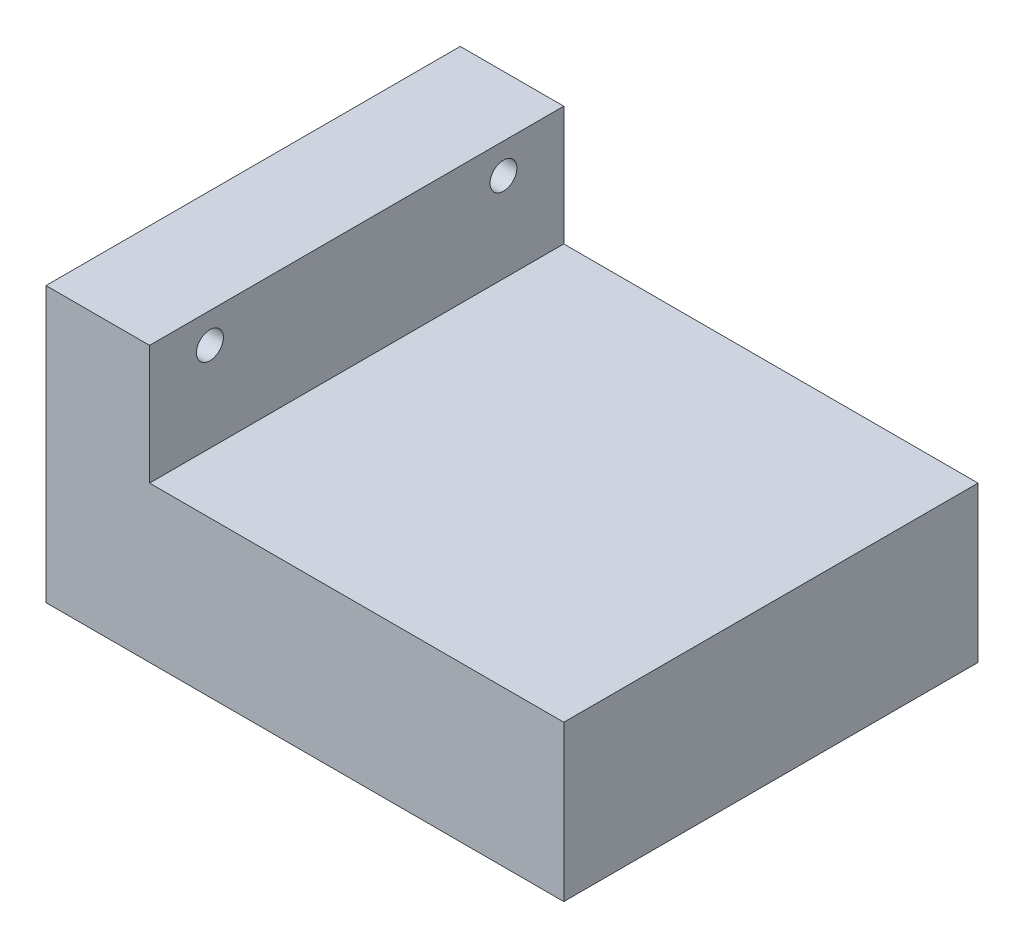
ISO-10303-21;
HEADER;
FILE_DESCRIPTION(('STEP AP214'),'2;1');
FILE_NAME('part.step','',(''),(''),'','','');
FILE_SCHEMA(('AUTOMOTIVE_DESIGN { 1 0 10303 214 1 1 1 1 }'));
ENDSEC;
DATA;
#1=APPLICATION_CONTEXT('core data for automotive mechanical design processes');
#2=APPLICATION_PROTOCOL_DEFINITION('international standard','automotive_design',2000,#1);
#3=PRODUCT_CONTEXT('',#1,'mechanical');
#4=PRODUCT('Part','Part','',(#3));
#5=PRODUCT_RELATED_PRODUCT_CATEGORY('part','',(#4));
#6=PRODUCT_DEFINITION_FORMATION('','',#4);
#7=PRODUCT_DEFINITION_CONTEXT('part definition',#1,'design');
#8=PRODUCT_DEFINITION('design','',#6,#7);
#9=PRODUCT_DEFINITION_SHAPE('','',#8);
#10=(LENGTH_UNIT() NAMED_UNIT(*) SI_UNIT(.MILLI.,.METRE.));
#11=(NAMED_UNIT(*) PLANE_ANGLE_UNIT() SI_UNIT($,.RADIAN.));
#12=(NAMED_UNIT(*) SI_UNIT($,.STERADIAN.) SOLID_ANGLE_UNIT());
#13=UNCERTAINTY_MEASURE_WITH_UNIT(LENGTH_MEASURE(1.E-05),#10,'distance_accuracy_value','');
#14=(GEOMETRIC_REPRESENTATION_CONTEXT(3) GLOBAL_UNCERTAINTY_ASSIGNED_CONTEXT((#13)) GLOBAL_UNIT_ASSIGNED_CONTEXT((#10,
#11,#12)) REPRESENTATION_CONTEXT('',''));
#15=CARTESIAN_POINT('',(0.,0.,0.));
#16=DIRECTION('',(0.,0.,1.));
#17=DIRECTION('',(1.,0.,0.));
#18=AXIS2_PLACEMENT_3D('',#15,#16,#17);
#19=CARTESIAN_POINT('',(31.75,19.05,0.));
#20=DIRECTION('',(1.,0.,0.));
#21=DIRECTION('',(0.,0.,-1.));
#22=AXIS2_PLACEMENT_3D('',#19,#20,#21);
#23=PLANE('',#22);
#24=DIRECTION('',(0.,0.,1.));
#25=VECTOR('',#24,1.);
#26=CARTESIAN_POINT('',(31.75,0.,0.));
#27=LINE('',#26,#25);
#28=CARTESIAN_POINT('',(31.75,0.,-25.4));
#29=VERTEX_POINT('',#28);
#30=CARTESIAN_POINT('',(31.75,0.,25.4));
#31=VERTEX_POINT('',#30);
#32=EDGE_CURVE('E83',#29,#31,#27,.T.);
#33=ORIENTED_EDGE('',*,*,#32,.F.);
#34=DIRECTION('',(0.,-1.,0.));
#35=VECTOR('',#34,1.);
#36=CARTESIAN_POINT('',(31.75,19.05,-25.4));
#37=LINE('',#36,#35);
#38=CARTESIAN_POINT('',(31.75,19.05,-25.4));
#39=VERTEX_POINT('',#38);
#40=EDGE_CURVE('E11',#39,#29,#37,.T.);
#41=ORIENTED_EDGE('',*,*,#40,.F.);
#42=DIRECTION('',(0.,0.,1.));
#43=VECTOR('',#42,1.);
#44=CARTESIAN_POINT('',(31.75,19.05,0.));
#45=LINE('',#44,#43);
#46=CARTESIAN_POINT('',(31.75,19.05,25.4));
#47=VERTEX_POINT('',#46);
#48=EDGE_CURVE('E81',#39,#47,#45,.T.);
#49=ORIENTED_EDGE('',*,*,#48,.T.);
#50=DIRECTION('',(0.,-1.,0.));
#51=VECTOR('',#50,1.);
#52=CARTESIAN_POINT('',(31.75,19.05,25.4));
#53=LINE('',#52,#51);
#54=EDGE_CURVE('E43',#47,#31,#53,.T.);
#55=ORIENTED_EDGE('',*,*,#54,.T.);
#56=EDGE_LOOP('',(#33,#41,#49,#55));
#57=FACE_BOUND('',#56,.T.);
#58=ADVANCED_FACE('F34',(#57),#23,.T.);
#59=CARTESIAN_POINT('',(0.,19.05,-25.4));
#60=DIRECTION('',(0.,0.,-1.));
#61=DIRECTION('',(-1.,0.,0.));
#62=AXIS2_PLACEMENT_3D('',#59,#60,#61);
#63=PLANE('',#62);
#64=DIRECTION('',(1.,0.,0.));
#65=VECTOR('',#64,1.);
#66=CARTESIAN_POINT('',(0.,0.,-25.4));
#67=LINE('',#66,#65);
#68=CARTESIAN_POINT('',(-31.75,0.,-25.4));
#69=VERTEX_POINT('',#68);
#70=EDGE_CURVE('E105',#69,#29,#67,.T.);
#71=ORIENTED_EDGE('',*,*,#70,.F.);
#72=DIRECTION('',(0.,-1.,0.));
#73=VECTOR('',#72,1.);
#74=CARTESIAN_POINT('',(-31.75,33.6804,-25.4));
#75=LINE('',#74,#73);
#76=CARTESIAN_POINT('',(-31.75,33.6804,-25.4));
#77=VERTEX_POINT('',#76);
#78=EDGE_CURVE('E122',#77,#69,#75,.T.);
#79=ORIENTED_EDGE('',*,*,#78,.F.);
#80=DIRECTION('',(1.,0.,0.));
#81=VECTOR('',#80,1.);
#82=CARTESIAN_POINT('',(0.,33.6804,-25.4));
#83=LINE('',#82,#81);
#84=CARTESIAN_POINT('',(-19.05,33.6804,-25.4));
#85=VERTEX_POINT('',#84);
#86=EDGE_CURVE('E130',#77,#85,#83,.T.);
#87=ORIENTED_EDGE('',*,*,#86,.T.);
#88=DIRECTION('',(0.,-1.,0.));
#89=VECTOR('',#88,1.);
#90=CARTESIAN_POINT('',(-19.05,33.6804,-25.4));
#91=LINE('',#90,#89);
#92=CARTESIAN_POINT('',(-19.05,19.05,-25.4));
#93=VERTEX_POINT('',#92);
#94=EDGE_CURVE('E92',#85,#93,#91,.T.);
#95=ORIENTED_EDGE('',*,*,#94,.T.);
#96=DIRECTION('',(1.,0.,0.));
#97=VECTOR('',#96,1.);
#98=CARTESIAN_POINT('',(0.,19.05,-25.4));
#99=LINE('',#98,#97);
#100=EDGE_CURVE('E87',#93,#39,#99,.T.);
#101=ORIENTED_EDGE('',*,*,#100,.T.);
#102=ORIENTED_EDGE('',*,*,#40,.T.);
#103=EDGE_LOOP('',(#71,#79,#87,#95,#101,#102));
#104=FACE_BOUND('',#103,.T.);
#105=ADVANCED_FACE('F90',(#104),#63,.T.);
#106=CARTESIAN_POINT('',(0.,19.05,25.4));
#107=DIRECTION('',(0.,0.,-1.));
#108=DIRECTION('',(-1.,0.,0.));
#109=AXIS2_PLACEMENT_3D('',#106,#107,#108);
#110=PLANE('',#109);
#111=DIRECTION('',(1.,0.,0.));
#112=VECTOR('',#111,1.);
#113=CARTESIAN_POINT('',(0.,0.,25.4));
#114=LINE('',#113,#112);
#115=CARTESIAN_POINT('',(-31.75,0.,25.4));
#116=VERTEX_POINT('',#115);
#117=EDGE_CURVE('E88',#116,#31,#114,.T.);
#118=ORIENTED_EDGE('',*,*,#117,.T.);
#119=ORIENTED_EDGE('',*,*,#54,.F.);
#120=DIRECTION('',(1.,0.,0.));
#121=VECTOR('',#120,1.);
#122=CARTESIAN_POINT('',(0.,19.05,25.4));
#123=LINE('',#122,#121);
#124=CARTESIAN_POINT('',(-19.05,19.05,25.4));
#125=VERTEX_POINT('',#124);
#126=EDGE_CURVE('E52',#125,#47,#123,.T.);
#127=ORIENTED_EDGE('',*,*,#126,.F.);
#128=DIRECTION('',(0.,-1.,0.));
#129=VECTOR('',#128,1.);
#130=CARTESIAN_POINT('',(-19.05,33.6804,25.4));
#131=LINE('',#130,#129);
#132=CARTESIAN_POINT('',(-19.05,33.6804,25.4));
#133=VERTEX_POINT('',#132);
#134=EDGE_CURVE('E132',#133,#125,#131,.T.);
#135=ORIENTED_EDGE('',*,*,#134,.F.);
#136=DIRECTION('',(1.,0.,0.));
#137=VECTOR('',#136,1.);
#138=CARTESIAN_POINT('',(0.,33.6804,25.4));
#139=LINE('',#138,#137);
#140=CARTESIAN_POINT('',(-31.75,33.6804,25.4));
#141=VERTEX_POINT('',#140);
#142=EDGE_CURVE('E148',#141,#133,#139,.T.);
#143=ORIENTED_EDGE('',*,*,#142,.F.);
#144=DIRECTION('',(0.,-1.,0.));
#145=VECTOR('',#144,1.);
#146=CARTESIAN_POINT('',(-31.75,33.6804,25.4));
#147=LINE('',#146,#145);
#148=EDGE_CURVE('E106',#141,#116,#147,.T.);
#149=ORIENTED_EDGE('',*,*,#148,.T.);
#150=EDGE_LOOP('',(#118,#119,#127,#135,#143,#149));
#151=FACE_BOUND('',#150,.T.);
#152=ADVANCED_FACE('F112',(#151),#110,.F.);
#153=CARTESIAN_POINT('',(0.,19.05,0.));
#154=DIRECTION('',(0.,1.,0.));
#155=DIRECTION('',(0.,0.,1.));
#156=AXIS2_PLACEMENT_3D('',#153,#154,#155);
#157=PLANE('',#156);
#158=ORIENTED_EDGE('',*,*,#48,.F.);
#159=ORIENTED_EDGE('',*,*,#100,.F.);
#160=DIRECTION('',(0.,0.,1.));
#161=VECTOR('',#160,1.);
#162=CARTESIAN_POINT('',(-19.05,19.05,0.));
#163=LINE('',#162,#161);
#164=EDGE_CURVE('E71',#93,#125,#163,.T.);
#165=ORIENTED_EDGE('',*,*,#164,.T.);
#166=ORIENTED_EDGE('',*,*,#126,.T.);
#167=EDGE_LOOP('',(#158,#159,#165,#166));
#168=FACE_BOUND('',#167,.T.);
#169=ADVANCED_FACE('F86',(#168),#157,.T.);
#170=CARTESIAN_POINT('',(0.,0.,0.));
#171=DIRECTION('',(0.,1.,0.));
#172=DIRECTION('',(0.,0.,1.));
#173=AXIS2_PLACEMENT_3D('',#170,#171,#172);
#174=PLANE('',#173);
#175=ORIENTED_EDGE('',*,*,#32,.T.);
#176=ORIENTED_EDGE('',*,*,#117,.F.);
#177=DIRECTION('',(0.,0.,1.));
#178=VECTOR('',#177,1.);
#179=CARTESIAN_POINT('',(-31.75,0.,0.));
#180=LINE('',#179,#178);
#181=EDGE_CURVE('E120',#69,#116,#180,.T.);
#182=ORIENTED_EDGE('',*,*,#181,.F.);
#183=ORIENTED_EDGE('',*,*,#70,.T.);
#184=EDGE_LOOP('',(#175,#176,#182,#183));
#185=FACE_BOUND('',#184,.T.);
#186=ADVANCED_FACE('F119',(#185),#174,.F.);
#187=CARTESIAN_POINT('',(-19.05,33.6804,0.));
#188=DIRECTION('',(1.,0.,0.));
#189=DIRECTION('',(0.,0.,-1.));
#190=AXIS2_PLACEMENT_3D('',#187,#188,#189);
#191=PLANE('',#190);
#192=CARTESIAN_POINT('',(-19.05,30.,18.));
#193=DIRECTION('',(1.,0.,0.));
#194=DIRECTION('',(0.,0.,-1.));
#195=AXIS2_PLACEMENT_3D('',#192,#193,#194);
#196=CIRCLE('',#195,1.64999999999998);
#197=CARTESIAN_POINT('',(-19.05,30.,16.35));
#198=VERTEX_POINT('',#197);
#199=EDGE_CURVE('E37',#198,#198,#196,.T.);
#200=ORIENTED_EDGE('',*,*,#199,.F.);
#201=EDGE_LOOP('',(#200));
#202=FACE_BOUND('',#201,.T.);
#203=CARTESIAN_POINT('',(-19.05,30.,-18.));
#204=DIRECTION('',(1.,0.,0.));
#205=DIRECTION('',(0.,0.,-1.));
#206=AXIS2_PLACEMENT_3D('',#203,#204,#205);
#207=CIRCLE('',#206,1.64999999999998);
#208=CARTESIAN_POINT('',(-19.05,30.,-19.65));
#209=VERTEX_POINT('',#208);
#210=EDGE_CURVE('E158',#209,#209,#207,.T.);
#211=ORIENTED_EDGE('',*,*,#210,.F.);
#212=EDGE_LOOP('',(#211));
#213=FACE_BOUND('',#212,.T.);
#214=ORIENTED_EDGE('',*,*,#164,.F.);
#215=ORIENTED_EDGE('',*,*,#94,.F.);
#216=DIRECTION('',(0.,0.,1.));
#217=VECTOR('',#216,1.);
#218=CARTESIAN_POINT('',(-19.05,33.6804,0.));
#219=LINE('',#218,#217);
#220=EDGE_CURVE('E134',#85,#133,#219,.T.);
#221=ORIENTED_EDGE('',*,*,#220,.T.);
#222=ORIENTED_EDGE('',*,*,#134,.T.);
#223=EDGE_LOOP('',(#214,#215,#221,#222));
#224=FACE_BOUND('',#223,.T.);
#225=ADVANCED_FACE('F144',(#202,#213,#224),#191,.T.);
#226=CARTESIAN_POINT('',(-31.75,33.6804,0.));
#227=DIRECTION('',(1.,0.,0.));
#228=DIRECTION('',(0.,0.,-1.));
#229=AXIS2_PLACEMENT_3D('',#226,#227,#228);
#230=PLANE('',#229);
#231=CARTESIAN_POINT('',(-31.75,30.,18.));
#232=DIRECTION('',(-1.,0.,0.));
#233=DIRECTION('',(0.,0.,1.));
#234=AXIS2_PLACEMENT_3D('',#231,#232,#233);
#235=CIRCLE('',#234,1.64999999999999);
#236=CARTESIAN_POINT('',(-31.75,30.,19.65));
#237=VERTEX_POINT('',#236);
#238=EDGE_CURVE('E164',#237,#237,#235,.T.);
#239=ORIENTED_EDGE('',*,*,#238,.F.);
#240=EDGE_LOOP('',(#239));
#241=FACE_BOUND('',#240,.T.);
#242=CARTESIAN_POINT('',(-31.75,30.,-18.));
#243=DIRECTION('',(-1.,0.,0.));
#244=DIRECTION('',(0.,0.,1.));
#245=AXIS2_PLACEMENT_3D('',#242,#243,#244);
#246=CIRCLE('',#245,1.64999999999998);
#247=CARTESIAN_POINT('',(-31.75,30.,-16.35));
#248=VERTEX_POINT('',#247);
#249=EDGE_CURVE('E161',#248,#248,#246,.T.);
#250=ORIENTED_EDGE('',*,*,#249,.F.);
#251=EDGE_LOOP('',(#250));
#252=FACE_BOUND('',#251,.T.);
#253=ORIENTED_EDGE('',*,*,#181,.T.);
#254=ORIENTED_EDGE('',*,*,#148,.F.);
#255=DIRECTION('',(0.,0.,1.));
#256=VECTOR('',#255,1.);
#257=CARTESIAN_POINT('',(-31.75,33.6804,0.));
#258=LINE('',#257,#256);
#259=EDGE_CURVE('E128',#77,#141,#258,.T.);
#260=ORIENTED_EDGE('',*,*,#259,.F.);
#261=ORIENTED_EDGE('',*,*,#78,.T.);
#262=EDGE_LOOP('',(#253,#254,#260,#261));
#263=FACE_BOUND('',#262,.T.);
#264=ADVANCED_FACE('F126',(#241,#252,#263),#230,.F.);
#265=CARTESIAN_POINT('',(0.,33.6804,0.));
#266=DIRECTION('',(0.,1.,0.));
#267=DIRECTION('',(0.,0.,1.));
#268=AXIS2_PLACEMENT_3D('',#265,#266,#267);
#269=PLANE('',#268);
#270=ORIENTED_EDGE('',*,*,#259,.T.);
#271=ORIENTED_EDGE('',*,*,#142,.T.);
#272=ORIENTED_EDGE('',*,*,#220,.F.);
#273=ORIENTED_EDGE('',*,*,#86,.F.);
#274=EDGE_LOOP('',(#270,#271,#272,#273));
#275=FACE_BOUND('',#274,.T.);
#276=ADVANCED_FACE('F153',(#275),#269,.T.);
#277=CARTESIAN_POINT('',(-31.75,30.,-18.));
#278=DIRECTION('',(-1.,0.,0.));
#279=DIRECTION('',(0.,0.,1.));
#280=AXIS2_PLACEMENT_3D('',#277,#278,#279);
#281=CYLINDRICAL_SURFACE('',#280,1.64999999999998);
#282=ORIENTED_EDGE('',*,*,#210,.T.);
#283=EDGE_LOOP('',(#282));
#284=FACE_BOUND('',#283,.T.);
#285=ORIENTED_EDGE('',*,*,#249,.T.);
#286=EDGE_LOOP('',(#285));
#287=FACE_BOUND('',#286,.T.);
#288=ADVANCED_FACE('F178',(#284,#287),#281,.F.);
#289=CARTESIAN_POINT('',(-31.75,30.,18.));
#290=DIRECTION('',(-1.,0.,0.));
#291=DIRECTION('',(0.,0.,1.));
#292=AXIS2_PLACEMENT_3D('',#289,#290,#291);
#293=CYLINDRICAL_SURFACE('',#292,1.64999999999998);
#294=ORIENTED_EDGE('',*,*,#199,.T.);
#295=EDGE_LOOP('',(#294));
#296=FACE_BOUND('',#295,.T.);
#297=ORIENTED_EDGE('',*,*,#238,.T.);
#298=EDGE_LOOP('',(#297));
#299=FACE_BOUND('',#298,.T.);
#300=ADVANCED_FACE('F171',(#296,#299),#293,.F.);
#301=CLOSED_SHELL('',(#58,#105,#152,#169,#186,#225,#264,#276,#288,#300));
#302=MANIFOLD_SOLID_BREP('B2',#301);
#303=ADVANCED_BREP_SHAPE_REPRESENTATION('',(#18,#302),#14);
#304=SHAPE_DEFINITION_REPRESENTATION(#9,#303);
ENDSEC;
END-ISO-10303-21;
